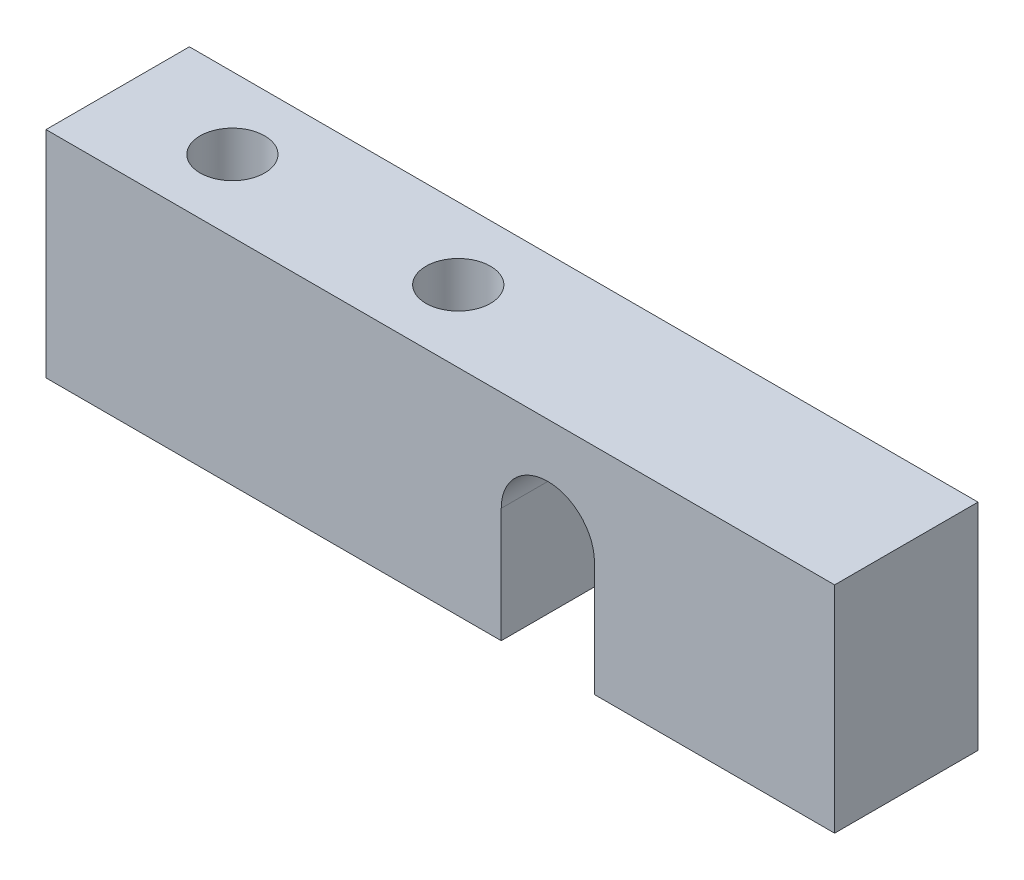
ISO-10303-21;
HEADER;
FILE_DESCRIPTION(('STEP AP214'),'2;1');
FILE_NAME('part.step','',(''),(''),'','','');
FILE_SCHEMA(('AUTOMOTIVE_DESIGN { 1 0 10303 214 1 1 1 1 }'));
ENDSEC;
DATA;
#1=APPLICATION_CONTEXT('core data for automotive mechanical design processes');
#2=APPLICATION_PROTOCOL_DEFINITION('international standard','automotive_design',2000,#1);
#3=PRODUCT_CONTEXT('',#1,'mechanical');
#4=PRODUCT('Part','Part','',(#3));
#5=PRODUCT_RELATED_PRODUCT_CATEGORY('part','',(#4));
#6=PRODUCT_DEFINITION_FORMATION('','',#4);
#7=PRODUCT_DEFINITION_CONTEXT('part definition',#1,'design');
#8=PRODUCT_DEFINITION('design','',#6,#7);
#9=PRODUCT_DEFINITION_SHAPE('','',#8);
#10=(LENGTH_UNIT() NAMED_UNIT(*) SI_UNIT(.MILLI.,.METRE.));
#11=(NAMED_UNIT(*) PLANE_ANGLE_UNIT() SI_UNIT($,.RADIAN.));
#12=(NAMED_UNIT(*) SI_UNIT($,.STERADIAN.) SOLID_ANGLE_UNIT());
#13=UNCERTAINTY_MEASURE_WITH_UNIT(LENGTH_MEASURE(1.E-05),#10,'distance_accuracy_value','');
#14=(GEOMETRIC_REPRESENTATION_CONTEXT(3) GLOBAL_UNCERTAINTY_ASSIGNED_CONTEXT((#13)) GLOBAL_UNIT_ASSIGNED_CONTEXT((#10,
#11,#12)) REPRESENTATION_CONTEXT('',''));
#15=CARTESIAN_POINT('',(0.,0.,0.));
#16=DIRECTION('',(0.,0.,1.));
#17=DIRECTION('',(1.,0.,0.));
#18=AXIS2_PLACEMENT_3D('',#15,#16,#17);
#19=CARTESIAN_POINT('',(0.,0.,0.));
#20=DIRECTION('',(0.,1.,0.));
#21=DIRECTION('',(0.,0.,1.));
#22=AXIS2_PLACEMENT_3D('',#19,#20,#21);
#23=PLANE('',#22);
#24=CARTESIAN_POINT('',(-30.5474952860605,0.,11.6013050519115));
#25=DIRECTION('',(0.,-1.,0.));
#26=DIRECTION('',(0.,0.,-1.));
#27=AXIS2_PLACEMENT_3D('',#24,#25,#26);
#28=CIRCLE('',#27,4.59);
#29=CARTESIAN_POINT('',(-30.5474952860605,0.,7.01130505191148));
#30=VERTEX_POINT('',#29);
#31=EDGE_CURVE('E181',#30,#30,#28,.T.);
#32=ORIENTED_EDGE('',*,*,#31,.F.);
#33=EDGE_LOOP('',(#32));
#34=FACE_BOUND('',#33,.T.);
#35=CARTESIAN_POINT('',(-14.7974952860605,0.,11.6013050519115));
#36=DIRECTION('',(0.,-1.,0.));
#37=DIRECTION('',(0.,0.,-1.));
#38=AXIS2_PLACEMENT_3D('',#35,#36,#37);
#39=CIRCLE('',#38,4.59);
#40=CARTESIAN_POINT('',(-14.7974952860605,0.,7.01130505191148));
#41=VERTEX_POINT('',#40);
#42=EDGE_CURVE('E172',#41,#41,#39,.T.);
#43=ORIENTED_EDGE('',*,*,#42,.F.);
#44=EDGE_LOOP('',(#43));
#45=FACE_BOUND('',#44,.T.);
#46=DIRECTION('',(-1.,0.,0.));
#47=VECTOR('',#46,1.);
#48=CARTESIAN_POINT('',(-38.5474952860605,0.,6.60130505191149));
#49=LINE('',#48,#47);
#50=CARTESIAN_POINT('',(-6.79749528606054,0.,6.60130505191149));
#51=VERTEX_POINT('',#50);
#52=CARTESIAN_POINT('',(-38.5474952860605,0.,6.60130505191149));
#53=VERTEX_POINT('',#52);
#54=EDGE_CURVE('E81',#51,#53,#49,.T.);
#55=ORIENTED_EDGE('',*,*,#54,.F.);
#56=DIRECTION('',(0.,0.,1.));
#57=VECTOR('',#56,1.);
#58=CARTESIAN_POINT('',(-6.79749528606054,0.,0.));
#59=LINE('',#58,#57);
#60=CARTESIAN_POINT('',(-6.79749528606054,0.,16.6013050519115));
#61=VERTEX_POINT('',#60);
#62=EDGE_CURVE('E11',#51,#61,#59,.T.);
#63=ORIENTED_EDGE('',*,*,#62,.T.);
#64=DIRECTION('',(1.,0.,0.));
#65=VECTOR('',#64,1.);
#66=CARTESIAN_POINT('',(-38.5474952860605,0.,16.6013050519115));
#67=LINE('',#66,#65);
#68=CARTESIAN_POINT('',(-38.5474952860605,0.,16.6013050519115));
#69=VERTEX_POINT('',#68);
#70=EDGE_CURVE('E153',#69,#61,#67,.T.);
#71=ORIENTED_EDGE('',*,*,#70,.F.);
#72=DIRECTION('',(0.,0.,1.));
#73=VECTOR('',#72,1.);
#74=CARTESIAN_POINT('',(-38.5474952860605,0.,6.60130505191149));
#75=LINE('',#74,#73);
#76=EDGE_CURVE('E142',#53,#69,#75,.T.);
#77=ORIENTED_EDGE('',*,*,#76,.F.);
#78=EDGE_LOOP('',(#55,#63,#71,#77));
#79=FACE_BOUND('',#78,.T.);
#80=ADVANCED_FACE('F34',(#34,#45,#79),#23,.F.);
#81=CARTESIAN_POINT('',(-38.5474952860605,15.,6.60130505191149));
#82=DIRECTION('',(1.,0.,0.));
#83=DIRECTION('',(0.,0.,-1.));
#84=AXIS2_PLACEMENT_3D('',#81,#82,#83);
#85=PLANE('',#84);
#86=ORIENTED_EDGE('',*,*,#76,.T.);
#87=DIRECTION('',(0.,-1.,0.));
#88=VECTOR('',#87,1.);
#89=CARTESIAN_POINT('',(-38.5474952860605,15.,16.6013050519115));
#90=LINE('',#89,#88);
#91=CARTESIAN_POINT('',(-38.5474952860605,15.,16.6013050519115));
#92=VERTEX_POINT('',#91);
#93=EDGE_CURVE('E165',#92,#69,#90,.T.);
#94=ORIENTED_EDGE('',*,*,#93,.F.);
#95=DIRECTION('',(0.,0.,1.));
#96=VECTOR('',#95,1.);
#97=CARTESIAN_POINT('',(-38.5474952860605,15.,6.60130505191149));
#98=LINE('',#97,#96);
#99=CARTESIAN_POINT('',(-38.5474952860605,15.,6.60130505191149));
#100=VERTEX_POINT('',#99);
#101=EDGE_CURVE('E143',#100,#92,#98,.T.);
#102=ORIENTED_EDGE('',*,*,#101,.F.);
#103=DIRECTION('',(0.,-1.,0.));
#104=VECTOR('',#103,1.);
#105=CARTESIAN_POINT('',(-38.5474952860605,15.,6.60130505191149));
#106=LINE('',#105,#104);
#107=EDGE_CURVE('E149',#100,#53,#106,.T.);
#108=ORIENTED_EDGE('',*,*,#107,.T.);
#109=EDGE_LOOP('',(#86,#94,#102,#108));
#110=FACE_BOUND('',#109,.T.);
#111=ADVANCED_FACE('F36',(#110),#85,.F.);
#112=CARTESIAN_POINT('',(-38.5474952860605,15.,16.6013050519115));
#113=DIRECTION('',(0.,0.,-1.));
#114=DIRECTION('',(-1.,0.,0.));
#115=AXIS2_PLACEMENT_3D('',#112,#113,#114);
#116=PLANE('',#115);
#117=ORIENTED_EDGE('',*,*,#70,.T.);
#118=DIRECTION('',(0.,1.,0.));
#119=VECTOR('',#118,1.);
#120=CARTESIAN_POINT('',(-6.79749528606054,15.,16.6013050519115));
#121=LINE('',#120,#119);
#122=CARTESIAN_POINT('',(-6.79749528606054,8.,16.6013050519115));
#123=VERTEX_POINT('',#122);
#124=EDGE_CURVE('E137',#61,#123,#121,.T.);
#125=ORIENTED_EDGE('',*,*,#124,.T.);
#126=CARTESIAN_POINT('',(-3.54749528606054,8.,16.6013050519115));
#127=DIRECTION('',(0.,0.,-1.));
#128=DIRECTION('',(-1.,0.,0.));
#129=AXIS2_PLACEMENT_3D('',#126,#127,#128);
#130=CIRCLE('',#129,3.25);
#131=CARTESIAN_POINT('',(-0.297495286060537,8.,16.6013050519115));
#132=VERTEX_POINT('',#131);
#133=EDGE_CURVE('E140',#123,#132,#130,.T.);
#134=ORIENTED_EDGE('',*,*,#133,.T.);
#135=DIRECTION('',(0.,-1.,0.));
#136=VECTOR('',#135,1.);
#137=CARTESIAN_POINT('',(-0.297495286060538,15.,16.6013050519115));
#138=LINE('',#137,#136);
#139=CARTESIAN_POINT('',(-0.297495286060537,0.,16.6013050519115));
#140=VERTEX_POINT('',#139);
#141=EDGE_CURVE('E113',#132,#140,#138,.T.);
#142=ORIENTED_EDGE('',*,*,#141,.T.);
#143=CARTESIAN_POINT('',(16.4525047139395,0.,16.6013050519115));
#144=VERTEX_POINT('',#143);
#145=EDGE_CURVE('E152',#140,#144,#67,.T.);
#146=ORIENTED_EDGE('',*,*,#145,.T.);
#147=DIRECTION('',(0.,-1.,0.));
#148=VECTOR('',#147,1.);
#149=CARTESIAN_POINT('',(16.4525047139395,15.,16.6013050519115));
#150=LINE('',#149,#148);
#151=CARTESIAN_POINT('',(16.4525047139395,15.,16.6013050519115));
#152=VERTEX_POINT('',#151);
#153=EDGE_CURVE('E162',#152,#144,#150,.T.);
#154=ORIENTED_EDGE('',*,*,#153,.F.);
#155=DIRECTION('',(1.,0.,0.));
#156=VECTOR('',#155,1.);
#157=CARTESIAN_POINT('',(-38.5474952860605,15.,16.6013050519115));
#158=LINE('',#157,#156);
#159=EDGE_CURVE('E89',#92,#152,#158,.T.);
#160=ORIENTED_EDGE('',*,*,#159,.F.);
#161=ORIENTED_EDGE('',*,*,#93,.T.);
#162=EDGE_LOOP('',(#117,#125,#134,#142,#146,#154,#160,#161));
#163=FACE_BOUND('',#162,.T.);
#164=ADVANCED_FACE('F203',(#163),#116,.F.);
#165=CARTESIAN_POINT('',(16.4525047139395,15.,6.60130505191149));
#166=DIRECTION('',(-1.,0.,0.));
#167=DIRECTION('',(0.,0.,1.));
#168=AXIS2_PLACEMENT_3D('',#165,#166,#167);
#169=PLANE('',#168);
#170=DIRECTION('',(0.,0.,-1.));
#171=VECTOR('',#170,1.);
#172=CARTESIAN_POINT('',(16.4525047139395,0.,6.60130505191149));
#173=LINE('',#172,#171);
#174=CARTESIAN_POINT('',(16.4525047139395,0.,6.60130505191149));
#175=VERTEX_POINT('',#174);
#176=EDGE_CURVE('E156',#144,#175,#173,.T.);
#177=ORIENTED_EDGE('',*,*,#176,.T.);
#178=DIRECTION('',(0.,-1.,0.));
#179=VECTOR('',#178,1.);
#180=CARTESIAN_POINT('',(16.4525047139395,15.,6.60130505191149));
#181=LINE('',#180,#179);
#182=CARTESIAN_POINT('',(16.4525047139395,15.,6.60130505191149));
#183=VERTEX_POINT('',#182);
#184=EDGE_CURVE('E160',#183,#175,#181,.T.);
#185=ORIENTED_EDGE('',*,*,#184,.F.);
#186=DIRECTION('',(0.,0.,-1.));
#187=VECTOR('',#186,1.);
#188=CARTESIAN_POINT('',(16.4525047139395,15.,6.60130505191149));
#189=LINE('',#188,#187);
#190=EDGE_CURVE('E146',#152,#183,#189,.T.);
#191=ORIENTED_EDGE('',*,*,#190,.F.);
#192=ORIENTED_EDGE('',*,*,#153,.T.);
#193=EDGE_LOOP('',(#177,#185,#191,#192));
#194=FACE_BOUND('',#193,.T.);
#195=ADVANCED_FACE('F225',(#194),#169,.F.);
#196=CARTESIAN_POINT('',(-38.5474952860605,15.,6.60130505191149));
#197=DIRECTION('',(0.,0.,1.));
#198=DIRECTION('',(1.,0.,0.));
#199=AXIS2_PLACEMENT_3D('',#196,#197,#198);
#200=PLANE('',#199);
#201=CARTESIAN_POINT('',(-3.54749528606054,8.,6.60130505191149));
#202=DIRECTION('',(0.,0.,-1.));
#203=DIRECTION('',(-1.,0.,0.));
#204=AXIS2_PLACEMENT_3D('',#201,#202,#203);
#205=CIRCLE('',#204,3.25);
#206=CARTESIAN_POINT('',(-6.79749528606054,8.,6.60130505191149));
#207=VERTEX_POINT('',#206);
#208=CARTESIAN_POINT('',(-0.297495286060537,8.,6.60130505191149));
#209=VERTEX_POINT('',#208);
#210=EDGE_CURVE('E120',#207,#209,#205,.T.);
#211=ORIENTED_EDGE('',*,*,#210,.F.);
#212=DIRECTION('',(0.,1.,0.));
#213=VECTOR('',#212,1.);
#214=CARTESIAN_POINT('',(-6.79749528606054,0.,6.60130505191149));
#215=LINE('',#214,#213);
#216=EDGE_CURVE('E117',#51,#207,#215,.T.);
#217=ORIENTED_EDGE('',*,*,#216,.F.);
#218=ORIENTED_EDGE('',*,*,#54,.T.);
#219=ORIENTED_EDGE('',*,*,#107,.F.);
#220=DIRECTION('',(-1.,0.,0.));
#221=VECTOR('',#220,1.);
#222=CARTESIAN_POINT('',(-38.5474952860605,15.,6.60130505191149));
#223=LINE('',#222,#221);
#224=EDGE_CURVE('E60',#183,#100,#223,.T.);
#225=ORIENTED_EDGE('',*,*,#224,.F.);
#226=ORIENTED_EDGE('',*,*,#184,.T.);
#227=CARTESIAN_POINT('',(-0.297495286060538,0.,6.60130505191149));
#228=VERTEX_POINT('',#227);
#229=EDGE_CURVE('E130',#175,#228,#49,.T.);
#230=ORIENTED_EDGE('',*,*,#229,.T.);
#231=DIRECTION('',(0.,-1.,0.));
#232=VECTOR('',#231,1.);
#233=CARTESIAN_POINT('',(-0.297495286060537,8.,6.60130505191149));
#234=LINE('',#233,#232);
#235=EDGE_CURVE('E51',#209,#228,#234,.T.);
#236=ORIENTED_EDGE('',*,*,#235,.F.);
#237=EDGE_LOOP('',(#211,#217,#218,#219,#225,#226,#230,#236));
#238=FACE_BOUND('',#237,.T.);
#239=ADVANCED_FACE('F127',(#238),#200,.F.);
#240=CARTESIAN_POINT('',(0.,15.,0.));
#241=DIRECTION('',(0.,1.,0.));
#242=DIRECTION('',(0.,0.,1.));
#243=AXIS2_PLACEMENT_3D('',#240,#241,#242);
#244=PLANE('',#243);
#245=CARTESIAN_POINT('',(-30.5474952860605,15.,11.6013050519115));
#246=DIRECTION('',(0.,1.,0.));
#247=DIRECTION('',(0.,0.,1.));
#248=AXIS2_PLACEMENT_3D('',#245,#246,#247);
#249=CIRCLE('',#248,2.25);
#250=CARTESIAN_POINT('',(-30.5474952860605,15.,13.8513050519115));
#251=VERTEX_POINT('',#250);
#252=EDGE_CURVE('E38',#251,#251,#249,.T.);
#253=ORIENTED_EDGE('',*,*,#252,.F.);
#254=EDGE_LOOP('',(#253));
#255=FACE_BOUND('',#254,.T.);
#256=CARTESIAN_POINT('',(-14.7974952860605,15.,11.6013050519115));
#257=DIRECTION('',(0.,1.,0.));
#258=DIRECTION('',(0.,0.,1.));
#259=AXIS2_PLACEMENT_3D('',#256,#257,#258);
#260=CIRCLE('',#259,2.25);
#261=CARTESIAN_POINT('',(-14.7974952860605,15.,13.8513050519115));
#262=VERTEX_POINT('',#261);
#263=EDGE_CURVE('E124',#262,#262,#260,.T.);
#264=ORIENTED_EDGE('',*,*,#263,.F.);
#265=EDGE_LOOP('',(#264));
#266=FACE_BOUND('',#265,.T.);
#267=ORIENTED_EDGE('',*,*,#101,.T.);
#268=ORIENTED_EDGE('',*,*,#159,.T.);
#269=ORIENTED_EDGE('',*,*,#190,.T.);
#270=ORIENTED_EDGE('',*,*,#224,.T.);
#271=EDGE_LOOP('',(#267,#268,#269,#270));
#272=FACE_BOUND('',#271,.T.);
#273=ADVANCED_FACE('F218',(#255,#266,#272),#244,.T.);
#274=ORIENTED_EDGE('',*,*,#145,.F.);
#275=DIRECTION('',(0.,0.,-1.));
#276=VECTOR('',#275,1.);
#277=CARTESIAN_POINT('',(-0.297495286060537,0.,0.));
#278=LINE('',#277,#276);
#279=EDGE_CURVE('E43',#140,#228,#278,.T.);
#280=ORIENTED_EDGE('',*,*,#279,.T.);
#281=ORIENTED_EDGE('',*,*,#229,.F.);
#282=ORIENTED_EDGE('',*,*,#176,.F.);
#283=EDGE_LOOP('',(#274,#280,#281,#282));
#284=FACE_BOUND('',#283,.T.);
#285=ADVANCED_FACE('F190',(#284),#23,.F.);
#286=CARTESIAN_POINT('',(-3.54749528606054,8.,21.6013050519115));
#287=DIRECTION('',(0.,0.,-1.));
#288=DIRECTION('',(-1.,0.,0.));
#289=AXIS2_PLACEMENT_3D('',#286,#287,#288);
#290=CYLINDRICAL_SURFACE('',#289,3.25);
#291=DIRECTION('',(0.,0.,-1.));
#292=VECTOR('',#291,1.);
#293=CARTESIAN_POINT('',(-6.79749528606054,8.,21.6013050519115));
#294=LINE('',#293,#292);
#295=EDGE_CURVE('E116',#123,#207,#294,.T.);
#296=ORIENTED_EDGE('',*,*,#295,.T.);
#297=ORIENTED_EDGE('',*,*,#210,.T.);
#298=DIRECTION('',(0.,0.,-1.));
#299=VECTOR('',#298,1.);
#300=CARTESIAN_POINT('',(-0.297495286060537,8.,21.6013050519115));
#301=LINE('',#300,#299);
#302=EDGE_CURVE('E109',#132,#209,#301,.T.);
#303=ORIENTED_EDGE('',*,*,#302,.F.);
#304=ORIENTED_EDGE('',*,*,#133,.F.);
#305=EDGE_LOOP('',(#296,#297,#303,#304));
#306=FACE_BOUND('',#305,.T.);
#307=ADVANCED_FACE('F121',(#306),#290,.F.);
#308=CARTESIAN_POINT('',(-6.79749528606054,0.,21.6013050519115));
#309=DIRECTION('',(-1.,0.,0.));
#310=DIRECTION('',(0.,-1.,0.));
#311=AXIS2_PLACEMENT_3D('',#308,#309,#310);
#312=PLANE('',#311);
#313=ORIENTED_EDGE('',*,*,#62,.F.);
#314=ORIENTED_EDGE('',*,*,#216,.T.);
#315=ORIENTED_EDGE('',*,*,#295,.F.);
#316=ORIENTED_EDGE('',*,*,#124,.F.);
#317=EDGE_LOOP('',(#313,#314,#315,#316));
#318=FACE_BOUND('',#317,.T.);
#319=ADVANCED_FACE('F205',(#318),#312,.F.);
#320=CARTESIAN_POINT('',(-0.297495286060537,8.,21.6013050519115));
#321=DIRECTION('',(1.,0.,0.));
#322=DIRECTION('',(0.,1.,0.));
#323=AXIS2_PLACEMENT_3D('',#320,#321,#322);
#324=PLANE('',#323);
#325=ORIENTED_EDGE('',*,*,#302,.T.);
#326=ORIENTED_EDGE('',*,*,#235,.T.);
#327=ORIENTED_EDGE('',*,*,#279,.F.);
#328=ORIENTED_EDGE('',*,*,#141,.F.);
#329=EDGE_LOOP('',(#325,#326,#327,#328));
#330=FACE_BOUND('',#329,.T.);
#331=ADVANCED_FACE('F111',(#330),#324,.F.);
#332=CARTESIAN_POINT('',(-14.7974952860605,0.,11.6013050519115));
#333=DIRECTION('',(0.,-1.,0.));
#334=DIRECTION('',(0.,0.,-1.));
#335=AXIS2_PLACEMENT_3D('',#332,#333,#334);
#336=CYLINDRICAL_SURFACE('',#335,2.25);
#337=ORIENTED_EDGE('',*,*,#263,.T.);
#338=EDGE_LOOP('',(#337));
#339=FACE_BOUND('',#338,.T.);
#340=CARTESIAN_POINT('',(-14.7974952860605,2.34,11.6013050519115));
#341=DIRECTION('',(0.,-1.,0.));
#342=DIRECTION('',(0.,0.,-1.));
#343=AXIS2_PLACEMENT_3D('',#340,#341,#342);
#344=CIRCLE('',#343,2.25);
#345=CARTESIAN_POINT('',(-14.7974952860605,2.34,9.35130505191149));
#346=VERTEX_POINT('',#345);
#347=EDGE_CURVE('E168',#346,#346,#344,.T.);
#348=ORIENTED_EDGE('',*,*,#347,.T.);
#349=EDGE_LOOP('',(#348));
#350=FACE_BOUND('',#349,.T.);
#351=ADVANCED_FACE('F212',(#339,#350),#336,.F.);
#352=CARTESIAN_POINT('',(-14.7974952860605,0.,11.6013050519115));
#353=DIRECTION('',(0.,-1.,0.));
#354=DIRECTION('',(0.,0.,-1.));
#355=AXIS2_PLACEMENT_3D('',#352,#353,#354);
#356=CONICAL_SURFACE('',#355,4.59,0.785398163397448);
#357=ORIENTED_EDGE('',*,*,#347,.F.);
#358=EDGE_LOOP('',(#357));
#359=FACE_BOUND('',#358,.T.);
#360=ORIENTED_EDGE('',*,*,#42,.T.);
#361=EDGE_LOOP('',(#360));
#362=FACE_BOUND('',#361,.T.);
#363=ADVANCED_FACE('F259',(#359,#362),#356,.F.);
#364=CARTESIAN_POINT('',(-30.5474952860605,0.,11.6013050519115));
#365=DIRECTION('',(0.,-1.,0.));
#366=DIRECTION('',(0.,0.,-1.));
#367=AXIS2_PLACEMENT_3D('',#364,#365,#366);
#368=CYLINDRICAL_SURFACE('',#367,2.25);
#369=ORIENTED_EDGE('',*,*,#252,.T.);
#370=EDGE_LOOP('',(#369));
#371=FACE_BOUND('',#370,.T.);
#372=CARTESIAN_POINT('',(-30.5474952860605,2.34,11.6013050519115));
#373=DIRECTION('',(0.,-1.,0.));
#374=DIRECTION('',(0.,0.,-1.));
#375=AXIS2_PLACEMENT_3D('',#372,#373,#374);
#376=CIRCLE('',#375,2.25);
#377=CARTESIAN_POINT('',(-30.5474952860605,2.34,9.35130505191149));
#378=VERTEX_POINT('',#377);
#379=EDGE_CURVE('E178',#378,#378,#376,.T.);
#380=ORIENTED_EDGE('',*,*,#379,.T.);
#381=EDGE_LOOP('',(#380));
#382=FACE_BOUND('',#381,.T.);
#383=ADVANCED_FACE('F267',(#371,#382),#368,.F.);
#384=CARTESIAN_POINT('',(-30.5474952860605,0.,11.6013050519115));
#385=DIRECTION('',(0.,-1.,0.));
#386=DIRECTION('',(0.,0.,-1.));
#387=AXIS2_PLACEMENT_3D('',#384,#385,#386);
#388=CONICAL_SURFACE('',#387,4.59,0.785398163397448);
#389=ORIENTED_EDGE('',*,*,#379,.F.);
#390=EDGE_LOOP('',(#389));
#391=FACE_BOUND('',#390,.T.);
#392=ORIENTED_EDGE('',*,*,#31,.T.);
#393=EDGE_LOOP('',(#392));
#394=FACE_BOUND('',#393,.T.);
#395=ADVANCED_FACE('F185',(#391,#394),#388,.F.);
#396=CLOSED_SHELL('',(#80,#111,#164,#195,#239,#273,#285,#307,#319,#331,#351,#363,#383,#395));
#397=MANIFOLD_SOLID_BREP('B2',#396);
#398=ADVANCED_BREP_SHAPE_REPRESENTATION('',(#18,#397),#14);
#399=SHAPE_DEFINITION_REPRESENTATION(#9,#398);
ENDSEC;
END-ISO-10303-21;
